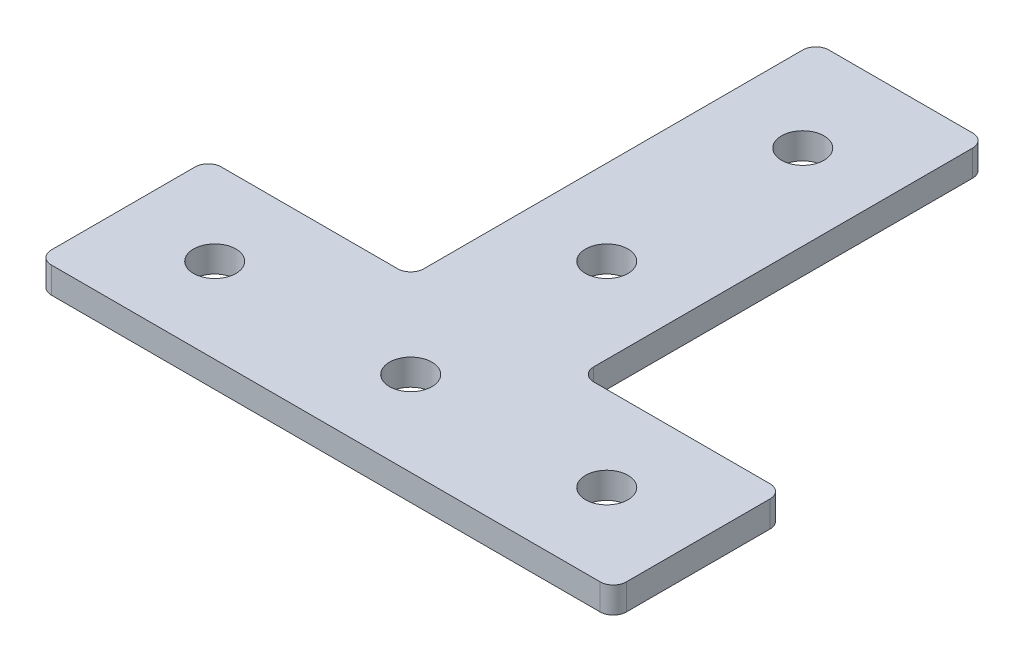
ISO-10303-21;
HEADER;
FILE_DESCRIPTION(('STEP AP214'),'2;1');
FILE_NAME('part.step','',(''),(''),'','','');
FILE_SCHEMA(('AUTOMOTIVE_DESIGN { 1 0 10303 214 1 1 1 1 }'));
ENDSEC;
DATA;
#1=APPLICATION_CONTEXT('core data for automotive mechanical design processes');
#2=APPLICATION_PROTOCOL_DEFINITION('international standard','automotive_design',2000,#1);
#3=PRODUCT_CONTEXT('',#1,'mechanical');
#4=PRODUCT('Part','Part','',(#3));
#5=PRODUCT_RELATED_PRODUCT_CATEGORY('part','',(#4));
#6=PRODUCT_DEFINITION_FORMATION('','',#4);
#7=PRODUCT_DEFINITION_CONTEXT('part definition',#1,'design');
#8=PRODUCT_DEFINITION('design','',#6,#7);
#9=PRODUCT_DEFINITION_SHAPE('','',#8);
#10=(LENGTH_UNIT() NAMED_UNIT(*) SI_UNIT(.MILLI.,.METRE.));
#11=(NAMED_UNIT(*) PLANE_ANGLE_UNIT() SI_UNIT($,.RADIAN.));
#12=(NAMED_UNIT(*) SI_UNIT($,.STERADIAN.) SOLID_ANGLE_UNIT());
#13=UNCERTAINTY_MEASURE_WITH_UNIT(LENGTH_MEASURE(1.E-05),#10,'distance_accuracy_value','');
#14=(GEOMETRIC_REPRESENTATION_CONTEXT(3) GLOBAL_UNCERTAINTY_ASSIGNED_CONTEXT((#13)) GLOBAL_UNIT_ASSIGNED_CONTEXT((#10,
#11,#12)) REPRESENTATION_CONTEXT('',''));
#15=CARTESIAN_POINT('',(0.,0.,0.));
#16=DIRECTION('',(0.,0.,1.));
#17=DIRECTION('',(1.,0.,0.));
#18=AXIS2_PLACEMENT_3D('',#15,#16,#17);
#19=CARTESIAN_POINT('',(44.,4.,-13.));
#20=DIRECTION('',(-1.,0.,0.));
#21=DIRECTION('',(0.,0.,1.));
#22=AXIS2_PLACEMENT_3D('',#19,#20,#21);
#23=PLANE('',#22);
#24=DIRECTION('',(0.,0.,-1.));
#25=VECTOR('',#24,1.);
#26=CARTESIAN_POINT('',(44.,4.,-13.));
#27=LINE('',#26,#25);
#28=CARTESIAN_POINT('',(44.,4.,11.));
#29=VERTEX_POINT('',#28);
#30=CARTESIAN_POINT('',(44.,4.,-11.));
#31=VERTEX_POINT('',#30);
#32=EDGE_CURVE('E180',#29,#31,#27,.T.);
#33=ORIENTED_EDGE('',*,*,#32,.F.);
#34=DIRECTION('',(0.,-1.,0.));
#35=VECTOR('',#34,1.);
#36=CARTESIAN_POINT('',(44.,4.,11.));
#37=LINE('',#36,#35);
#38=CARTESIAN_POINT('',(44.,0.,11.));
#39=VERTEX_POINT('',#38);
#40=EDGE_CURVE('E224',#29,#39,#37,.T.);
#41=ORIENTED_EDGE('',*,*,#40,.T.);
#42=DIRECTION('',(0.,0.,-1.));
#43=VECTOR('',#42,1.);
#44=CARTESIAN_POINT('',(44.,0.,-13.));
#45=LINE('',#44,#43);
#46=CARTESIAN_POINT('',(44.,0.,-11.));
#47=VERTEX_POINT('',#46);
#48=EDGE_CURVE('E258',#39,#47,#45,.T.);
#49=ORIENTED_EDGE('',*,*,#48,.T.);
#50=DIRECTION('',(0.,-1.,0.));
#51=VECTOR('',#50,1.);
#52=CARTESIAN_POINT('',(44.,4.,-11.));
#53=LINE('',#52,#51);
#54=EDGE_CURVE('E222',#47,#31,#53,.F.);
#55=ORIENTED_EDGE('',*,*,#54,.T.);
#56=EDGE_LOOP('',(#33,#41,#49,#55));
#57=FACE_BOUND('',#56,.T.);
#58=ADVANCED_FACE('F39',(#57),#23,.F.);
#59=CARTESIAN_POINT('',(44.,4.,-13.));
#60=DIRECTION('',(0.,0.,1.));
#61=DIRECTION('',(1.,0.,0.));
#62=AXIS2_PLACEMENT_3D('',#59,#60,#61);
#63=PLANE('',#62);
#64=DIRECTION('',(-1.,0.,0.));
#65=VECTOR('',#64,1.);
#66=CARTESIAN_POINT('',(44.,4.,-13.));
#67=LINE('',#66,#65);
#68=CARTESIAN_POINT('',(42.,4.,-13.));
#69=VERTEX_POINT('',#68);
#70=CARTESIAN_POINT('',(15.,4.,-13.));
#71=VERTEX_POINT('',#70);
#72=EDGE_CURVE('E184',#69,#71,#67,.T.);
#73=ORIENTED_EDGE('',*,*,#72,.F.);
#74=DIRECTION('',(0.,-1.,0.));
#75=VECTOR('',#74,1.);
#76=CARTESIAN_POINT('',(42.,4.,-13.));
#77=LINE('',#76,#75);
#78=CARTESIAN_POINT('',(42.,0.,-13.));
#79=VERTEX_POINT('',#78);
#80=EDGE_CURVE('E229',#69,#79,#77,.T.);
#81=ORIENTED_EDGE('',*,*,#80,.T.);
#82=DIRECTION('',(-1.,0.,0.));
#83=VECTOR('',#82,1.);
#84=CARTESIAN_POINT('',(44.,0.,-13.));
#85=LINE('',#84,#83);
#86=CARTESIAN_POINT('',(15.,0.,-13.));
#87=VERTEX_POINT('',#86);
#88=EDGE_CURVE('E247',#79,#87,#85,.T.);
#89=ORIENTED_EDGE('',*,*,#88,.T.);
#90=DIRECTION('',(0.,-1.,0.));
#91=VECTOR('',#90,1.);
#92=CARTESIAN_POINT('',(15.,4.,-13.));
#93=LINE('',#92,#91);
#94=EDGE_CURVE('E227',#87,#71,#93,.F.);
#95=ORIENTED_EDGE('',*,*,#94,.T.);
#96=EDGE_LOOP('',(#73,#81,#89,#95));
#97=FACE_BOUND('',#96,.T.);
#98=ADVANCED_FACE('F255',(#97),#63,.F.);
#99=CARTESIAN_POINT('',(13.,4.,-13.));
#100=DIRECTION('',(-1.,0.,0.));
#101=DIRECTION('',(0.,0.,1.));
#102=AXIS2_PLACEMENT_3D('',#99,#100,#101);
#103=PLANE('',#102);
#104=DIRECTION('',(0.,0.,-1.));
#105=VECTOR('',#104,1.);
#106=CARTESIAN_POINT('',(13.,4.,-13.));
#107=LINE('',#106,#105);
#108=CARTESIAN_POINT('',(13.,4.,-15.));
#109=VERTEX_POINT('',#108);
#110=CARTESIAN_POINT('',(13.,4.,-73.));
#111=VERTEX_POINT('',#110);
#112=EDGE_CURVE('E266',#109,#111,#107,.T.);
#113=ORIENTED_EDGE('',*,*,#112,.F.);
#114=DIRECTION('',(0.,-1.,0.));
#115=VECTOR('',#114,1.);
#116=CARTESIAN_POINT('',(13.,0.,-15.));
#117=LINE('',#116,#115);
#118=CARTESIAN_POINT('',(13.,0.,-15.));
#119=VERTEX_POINT('',#118);
#120=EDGE_CURVE('E234',#109,#119,#117,.T.);
#121=ORIENTED_EDGE('',*,*,#120,.T.);
#122=DIRECTION('',(0.,0.,-1.));
#123=VECTOR('',#122,1.);
#124=CARTESIAN_POINT('',(13.,0.,-13.));
#125=LINE('',#124,#123);
#126=CARTESIAN_POINT('',(13.,0.,-73.));
#127=VERTEX_POINT('',#126);
#128=EDGE_CURVE('E249',#119,#127,#125,.T.);
#129=ORIENTED_EDGE('',*,*,#128,.T.);
#130=DIRECTION('',(0.,-1.,0.));
#131=VECTOR('',#130,1.);
#132=CARTESIAN_POINT('',(13.,4.,-73.));
#133=LINE('',#132,#131);
#134=EDGE_CURVE('E232',#127,#111,#133,.F.);
#135=ORIENTED_EDGE('',*,*,#134,.T.);
#136=EDGE_LOOP('',(#113,#121,#129,#135));
#137=FACE_BOUND('',#136,.T.);
#138=ADVANCED_FACE('F269',(#137),#103,.F.);
#139=CARTESIAN_POINT('',(-13.,4.,-75.));
#140=DIRECTION('',(0.,0.,1.));
#141=DIRECTION('',(1.,0.,0.));
#142=AXIS2_PLACEMENT_3D('',#139,#140,#141);
#143=PLANE('',#142);
#144=DIRECTION('',(-1.,0.,0.));
#145=VECTOR('',#144,1.);
#146=CARTESIAN_POINT('',(-13.,4.,-75.));
#147=LINE('',#146,#145);
#148=CARTESIAN_POINT('',(11.,4.,-75.));
#149=VERTEX_POINT('',#148);
#150=CARTESIAN_POINT('',(-11.,4.,-75.));
#151=VERTEX_POINT('',#150);
#152=EDGE_CURVE('E271',#149,#151,#147,.T.);
#153=ORIENTED_EDGE('',*,*,#152,.F.);
#154=DIRECTION('',(0.,-1.,0.));
#155=VECTOR('',#154,1.);
#156=CARTESIAN_POINT('',(11.,4.,-75.));
#157=LINE('',#156,#155);
#158=CARTESIAN_POINT('',(11.,0.,-75.));
#159=VERTEX_POINT('',#158);
#160=EDGE_CURVE('E239',#149,#159,#157,.T.);
#161=ORIENTED_EDGE('',*,*,#160,.T.);
#162=DIRECTION('',(-1.,0.,0.));
#163=VECTOR('',#162,1.);
#164=CARTESIAN_POINT('',(-13.,0.,-75.));
#165=LINE('',#164,#163);
#166=CARTESIAN_POINT('',(-11.,0.,-75.));
#167=VERTEX_POINT('',#166);
#168=EDGE_CURVE('E288',#159,#167,#165,.T.);
#169=ORIENTED_EDGE('',*,*,#168,.T.);
#170=DIRECTION('',(0.,-1.,0.));
#171=VECTOR('',#170,1.);
#172=CARTESIAN_POINT('',(-11.,4.,-75.));
#173=LINE('',#172,#171);
#174=EDGE_CURVE('E237',#167,#151,#173,.F.);
#175=ORIENTED_EDGE('',*,*,#174,.T.);
#176=EDGE_LOOP('',(#153,#161,#169,#175));
#177=FACE_BOUND('',#176,.T.);
#178=ADVANCED_FACE('F352',(#177),#143,.F.);
#179=CARTESIAN_POINT('',(-13.,4.,-13.));
#180=DIRECTION('',(1.,0.,0.));
#181=DIRECTION('',(0.,0.,-1.));
#182=AXIS2_PLACEMENT_3D('',#179,#180,#181);
#183=PLANE('',#182);
#184=DIRECTION('',(0.,0.,1.));
#185=VECTOR('',#184,1.);
#186=CARTESIAN_POINT('',(-13.,0.,-13.));
#187=LINE('',#186,#185);
#188=CARTESIAN_POINT('',(-13.,0.,-73.));
#189=VERTEX_POINT('',#188);
#190=CARTESIAN_POINT('',(-13.,0.,-15.));
#191=VERTEX_POINT('',#190);
#192=EDGE_CURVE('E291',#189,#191,#187,.T.);
#193=ORIENTED_EDGE('',*,*,#192,.T.);
#194=DIRECTION('',(0.,-1.,0.));
#195=VECTOR('',#194,1.);
#196=CARTESIAN_POINT('',(-13.,4.,-15.));
#197=LINE('',#196,#195);
#198=CARTESIAN_POINT('',(-13.,4.,-15.));
#199=VERTEX_POINT('',#198);
#200=EDGE_CURVE('E220',#191,#199,#197,.F.);
#201=ORIENTED_EDGE('',*,*,#200,.T.);
#202=DIRECTION('',(0.,0.,1.));
#203=VECTOR('',#202,1.);
#204=CARTESIAN_POINT('',(-13.,4.,-13.));
#205=LINE('',#204,#203);
#206=CARTESIAN_POINT('',(-13.,4.,-73.));
#207=VERTEX_POINT('',#206);
#208=EDGE_CURVE('E274',#207,#199,#205,.T.);
#209=ORIENTED_EDGE('',*,*,#208,.F.);
#210=DIRECTION('',(0.,-1.,0.));
#211=VECTOR('',#210,1.);
#212=CARTESIAN_POINT('',(-13.,4.,-73.));
#213=LINE('',#212,#211);
#214=EDGE_CURVE('E217',#207,#189,#213,.T.);
#215=ORIENTED_EDGE('',*,*,#214,.T.);
#216=EDGE_LOOP('',(#193,#201,#209,#215));
#217=FACE_BOUND('',#216,.T.);
#218=ADVANCED_FACE('F310',(#217),#183,.F.);
#219=CARTESIAN_POINT('',(-44.,4.,-13.));
#220=DIRECTION('',(0.,0.,1.));
#221=DIRECTION('',(1.,0.,0.));
#222=AXIS2_PLACEMENT_3D('',#219,#220,#221);
#223=PLANE('',#222);
#224=DIRECTION('',(-1.,0.,0.));
#225=VECTOR('',#224,1.);
#226=CARTESIAN_POINT('',(-44.,0.,-13.));
#227=LINE('',#226,#225);
#228=CARTESIAN_POINT('',(-15.,0.,-13.));
#229=VERTEX_POINT('',#228);
#230=CARTESIAN_POINT('',(-42.,0.,-13.));
#231=VERTEX_POINT('',#230);
#232=EDGE_CURVE('E186',#229,#231,#227,.T.);
#233=ORIENTED_EDGE('',*,*,#232,.T.);
#234=DIRECTION('',(0.,-1.,0.));
#235=VECTOR('',#234,1.);
#236=CARTESIAN_POINT('',(-42.,4.,-13.));
#237=LINE('',#236,#235);
#238=CARTESIAN_POINT('',(-42.,4.,-13.));
#239=VERTEX_POINT('',#238);
#240=EDGE_CURVE('E54',#231,#239,#237,.F.);
#241=ORIENTED_EDGE('',*,*,#240,.T.);
#242=DIRECTION('',(-1.,0.,0.));
#243=VECTOR('',#242,1.);
#244=CARTESIAN_POINT('',(-44.,4.,-13.));
#245=LINE('',#244,#243);
#246=CARTESIAN_POINT('',(-15.,4.,-13.));
#247=VERTEX_POINT('',#246);
#248=EDGE_CURVE('E279',#247,#239,#245,.T.);
#249=ORIENTED_EDGE('',*,*,#248,.F.);
#250=DIRECTION('',(0.,-1.,0.));
#251=VECTOR('',#250,1.);
#252=CARTESIAN_POINT('',(-15.,0.,-13.));
#253=LINE('',#252,#251);
#254=EDGE_CURVE('E213',#247,#229,#253,.T.);
#255=ORIENTED_EDGE('',*,*,#254,.T.);
#256=EDGE_LOOP('',(#233,#241,#249,#255));
#257=FACE_BOUND('',#256,.T.);
#258=ADVANCED_FACE('F294',(#257),#223,.F.);
#259=CARTESIAN_POINT('',(-44.,4.,-13.));
#260=DIRECTION('',(1.,0.,0.));
#261=DIRECTION('',(0.,0.,-1.));
#262=AXIS2_PLACEMENT_3D('',#259,#260,#261);
#263=PLANE('',#262);
#264=DIRECTION('',(0.,0.,1.));
#265=VECTOR('',#264,1.);
#266=CARTESIAN_POINT('',(-44.,0.,-13.));
#267=LINE('',#266,#265);
#268=CARTESIAN_POINT('',(-44.,0.,-11.));
#269=VERTEX_POINT('',#268);
#270=CARTESIAN_POINT('',(-44.,0.,11.));
#271=VERTEX_POINT('',#270);
#272=EDGE_CURVE('E181',#269,#271,#267,.T.);
#273=ORIENTED_EDGE('',*,*,#272,.T.);
#274=DIRECTION('',(0.,-1.,0.));
#275=VECTOR('',#274,1.);
#276=CARTESIAN_POINT('',(-44.,4.,11.));
#277=LINE('',#276,#275);
#278=CARTESIAN_POINT('',(-44.,4.,11.));
#279=VERTEX_POINT('',#278);
#280=EDGE_CURVE('E158',#271,#279,#277,.F.);
#281=ORIENTED_EDGE('',*,*,#280,.T.);
#282=DIRECTION('',(0.,0.,1.));
#283=VECTOR('',#282,1.);
#284=CARTESIAN_POINT('',(-44.,4.,-13.));
#285=LINE('',#284,#283);
#286=CARTESIAN_POINT('',(-44.,4.,-11.));
#287=VERTEX_POINT('',#286);
#288=EDGE_CURVE('E281',#287,#279,#285,.T.);
#289=ORIENTED_EDGE('',*,*,#288,.F.);
#290=DIRECTION('',(0.,-1.,0.));
#291=VECTOR('',#290,1.);
#292=CARTESIAN_POINT('',(-44.,4.,-11.));
#293=LINE('',#292,#291);
#294=EDGE_CURVE('E163',#287,#269,#293,.T.);
#295=ORIENTED_EDGE('',*,*,#294,.T.);
#296=EDGE_LOOP('',(#273,#281,#289,#295));
#297=FACE_BOUND('',#296,.T.);
#298=ADVANCED_FACE('F302',(#297),#263,.F.);
#299=CARTESIAN_POINT('',(-44.,4.,13.));
#300=DIRECTION('',(0.,0.,-1.));
#301=DIRECTION('',(-1.,0.,0.));
#302=AXIS2_PLACEMENT_3D('',#299,#300,#301);
#303=PLANE('',#302);
#304=DIRECTION('',(1.,0.,0.));
#305=VECTOR('',#304,1.);
#306=CARTESIAN_POINT('',(-44.,4.,13.));
#307=LINE('',#306,#305);
#308=CARTESIAN_POINT('',(-42.,4.,13.));
#309=VERTEX_POINT('',#308);
#310=CARTESIAN_POINT('',(42.,4.,13.));
#311=VERTEX_POINT('',#310);
#312=EDGE_CURVE('E173',#309,#311,#307,.T.);
#313=ORIENTED_EDGE('',*,*,#312,.F.);
#314=DIRECTION('',(0.,-1.,0.));
#315=VECTOR('',#314,1.);
#316=CARTESIAN_POINT('',(-42.,4.,13.));
#317=LINE('',#316,#315);
#318=CARTESIAN_POINT('',(-42.,0.,13.));
#319=VERTEX_POINT('',#318);
#320=EDGE_CURVE('E157',#309,#319,#317,.T.);
#321=ORIENTED_EDGE('',*,*,#320,.T.);
#322=DIRECTION('',(1.,0.,0.));
#323=VECTOR('',#322,1.);
#324=CARTESIAN_POINT('',(-44.,0.,13.));
#325=LINE('',#324,#323);
#326=CARTESIAN_POINT('',(42.,0.,13.));
#327=VERTEX_POINT('',#326);
#328=EDGE_CURVE('E170',#319,#327,#325,.T.);
#329=ORIENTED_EDGE('',*,*,#328,.T.);
#330=DIRECTION('',(0.,-1.,0.));
#331=VECTOR('',#330,1.);
#332=CARTESIAN_POINT('',(42.,4.,13.));
#333=LINE('',#332,#331);
#334=EDGE_CURVE('E175',#327,#311,#333,.F.);
#335=ORIENTED_EDGE('',*,*,#334,.T.);
#336=EDGE_LOOP('',(#313,#321,#329,#335));
#337=FACE_BOUND('',#336,.T.);
#338=ADVANCED_FACE('F169',(#337),#303,.F.);
#339=CARTESIAN_POINT('',(0.,4.,0.));
#340=DIRECTION('',(0.,1.,0.));
#341=DIRECTION('',(0.,0.,1.));
#342=AXIS2_PLACEMENT_3D('',#339,#340,#341);
#343=PLANE('',#342);
#344=CARTESIAN_POINT('',(3.12396350297161E-13,4.,-30.));
#345=DIRECTION('',(0.,1.,0.));
#346=DIRECTION('',(0.,0.,1.));
#347=AXIS2_PLACEMENT_3D('',#344,#345,#346);
#348=CIRCLE('',#347,3.25);
#349=CARTESIAN_POINT('',(3.12396350297161E-13,4.,-26.75));
#350=VERTEX_POINT('',#349);
#351=EDGE_CURVE('E518',#350,#350,#348,.T.);
#352=ORIENTED_EDGE('',*,*,#351,.F.);
#353=EDGE_LOOP('',(#352));
#354=FACE_BOUND('',#353,.T.);
#355=CARTESIAN_POINT('',(0.,4.,-60.));
#356=DIRECTION('',(0.,1.,0.));
#357=DIRECTION('',(0.,0.,1.));
#358=AXIS2_PLACEMENT_3D('',#355,#356,#357);
#359=CIRCLE('',#358,3.25);
#360=CARTESIAN_POINT('',(0.,4.,-56.75));
#361=VERTEX_POINT('',#360);
#362=EDGE_CURVE('E522',#361,#361,#359,.T.);
#363=ORIENTED_EDGE('',*,*,#362,.F.);
#364=EDGE_LOOP('',(#363));
#365=FACE_BOUND('',#364,.T.);
#366=CARTESIAN_POINT('',(-30.,4.,2.09488880330588E-13));
#367=DIRECTION('',(0.,1.,0.));
#368=DIRECTION('',(0.,0.,1.));
#369=AXIS2_PLACEMENT_3D('',#366,#367,#368);
#370=CIRCLE('',#369,3.25);
#371=CARTESIAN_POINT('',(-30.,4.,3.25000000000021));
#372=VERTEX_POINT('',#371);
#373=EDGE_CURVE('E540',#372,#372,#370,.T.);
#374=ORIENTED_EDGE('',*,*,#373,.F.);
#375=EDGE_LOOP('',(#374));
#376=FACE_BOUND('',#375,.T.);
#377=CARTESIAN_POINT('',(30.,4.,0.));
#378=DIRECTION('',(0.,1.,0.));
#379=DIRECTION('',(0.,0.,1.));
#380=AXIS2_PLACEMENT_3D('',#377,#378,#379);
#381=CIRCLE('',#380,3.25);
#382=CARTESIAN_POINT('',(30.,4.,3.25));
#383=VERTEX_POINT('',#382);
#384=EDGE_CURVE('E531',#383,#383,#381,.T.);
#385=ORIENTED_EDGE('',*,*,#384,.F.);
#386=EDGE_LOOP('',(#385));
#387=FACE_BOUND('',#386,.T.);
#388=CARTESIAN_POINT('',(0.,4.,0.));
#389=DIRECTION('',(0.,1.,0.));
#390=DIRECTION('',(0.,0.,1.));
#391=AXIS2_PLACEMENT_3D('',#388,#389,#390);
#392=CIRCLE('',#391,3.25);
#393=CARTESIAN_POINT('',(0.,4.,3.25));
#394=VERTEX_POINT('',#393);
#395=EDGE_CURVE('E529',#394,#394,#392,.T.);
#396=ORIENTED_EDGE('',*,*,#395,.F.);
#397=EDGE_LOOP('',(#396));
#398=FACE_BOUND('',#397,.T.);
#399=ORIENTED_EDGE('',*,*,#288,.T.);
#400=CARTESIAN_POINT('',(-42.,4.,11.));
#401=DIRECTION('',(0.,1.,0.));
#402=DIRECTION('',(0.,0.,1.));
#403=AXIS2_PLACEMENT_3D('',#400,#401,#402);
#404=CIRCLE('',#403,2.);
#405=EDGE_CURVE('E211',#279,#309,#404,.T.);
#406=ORIENTED_EDGE('',*,*,#405,.T.);
#407=ORIENTED_EDGE('',*,*,#312,.T.);
#408=CARTESIAN_POINT('',(42.,4.,11.));
#409=DIRECTION('',(0.,1.,0.));
#410=DIRECTION('',(0.,0.,1.));
#411=AXIS2_PLACEMENT_3D('',#408,#409,#410);
#412=CIRCLE('',#411,2.);
#413=EDGE_CURVE('E207',#311,#29,#412,.T.);
#414=ORIENTED_EDGE('',*,*,#413,.T.);
#415=ORIENTED_EDGE('',*,*,#32,.T.);
#416=CARTESIAN_POINT('',(42.,4.,-11.));
#417=DIRECTION('',(0.,1.,0.));
#418=DIRECTION('',(0.,0.,1.));
#419=AXIS2_PLACEMENT_3D('',#416,#417,#418);
#420=CIRCLE('',#419,2.);
#421=EDGE_CURVE('E205',#31,#69,#420,.T.);
#422=ORIENTED_EDGE('',*,*,#421,.T.);
#423=ORIENTED_EDGE('',*,*,#72,.T.);
#424=CARTESIAN_POINT('',(15.,4.,-15.));
#425=DIRECTION('',(0.,1.,0.));
#426=DIRECTION('',(0.,0.,1.));
#427=AXIS2_PLACEMENT_3D('',#424,#425,#426);
#428=CIRCLE('',#427,2.);
#429=EDGE_CURVE('E11',#71,#109,#428,.F.);
#430=ORIENTED_EDGE('',*,*,#429,.T.);
#431=ORIENTED_EDGE('',*,*,#112,.T.);
#432=CARTESIAN_POINT('',(11.,4.,-73.));
#433=DIRECTION('',(0.,1.,0.));
#434=DIRECTION('',(0.,0.,1.));
#435=AXIS2_PLACEMENT_3D('',#432,#433,#434);
#436=CIRCLE('',#435,2.);
#437=EDGE_CURVE('E203',#111,#149,#436,.T.);
#438=ORIENTED_EDGE('',*,*,#437,.T.);
#439=ORIENTED_EDGE('',*,*,#152,.T.);
#440=CARTESIAN_POINT('',(-11.,4.,-73.));
#441=DIRECTION('',(0.,1.,0.));
#442=DIRECTION('',(0.,0.,1.));
#443=AXIS2_PLACEMENT_3D('',#440,#441,#442);
#444=CIRCLE('',#443,2.);
#445=EDGE_CURVE('E201',#151,#207,#444,.T.);
#446=ORIENTED_EDGE('',*,*,#445,.T.);
#447=ORIENTED_EDGE('',*,*,#208,.T.);
#448=CARTESIAN_POINT('',(-15.,4.,-15.));
#449=DIRECTION('',(0.,1.,0.));
#450=DIRECTION('',(0.,0.,1.));
#451=AXIS2_PLACEMENT_3D('',#448,#449,#450);
#452=CIRCLE('',#451,2.);
#453=EDGE_CURVE('E61',#199,#247,#452,.F.);
#454=ORIENTED_EDGE('',*,*,#453,.T.);
#455=ORIENTED_EDGE('',*,*,#248,.T.);
#456=CARTESIAN_POINT('',(-42.,4.,-11.));
#457=DIRECTION('',(0.,1.,0.));
#458=DIRECTION('',(0.,0.,1.));
#459=AXIS2_PLACEMENT_3D('',#456,#457,#458);
#460=CIRCLE('',#459,2.);
#461=EDGE_CURVE('E209',#239,#287,#460,.T.);
#462=ORIENTED_EDGE('',*,*,#461,.T.);
#463=EDGE_LOOP('',(#399,#406,#407,#414,#415,#422,#423,#430,#431,#438,#439,#446,#447,#454,#455,#462));
#464=FACE_BOUND('',#463,.T.);
#465=ADVANCED_FACE('F265',(#354,#365,#376,#387,#398,#464),#343,.T.);
#466=CARTESIAN_POINT('',(0.,0.,0.));
#467=DIRECTION('',(0.,1.,0.));
#468=DIRECTION('',(0.,0.,1.));
#469=AXIS2_PLACEMENT_3D('',#466,#467,#468);
#470=PLANE('',#469);
#471=CARTESIAN_POINT('',(3.12396350297161E-13,0.,-30.));
#472=DIRECTION('',(0.,1.,0.));
#473=DIRECTION('',(0.,0.,1.));
#474=AXIS2_PLACEMENT_3D('',#471,#472,#473);
#475=CIRCLE('',#474,3.25);
#476=CARTESIAN_POINT('',(3.12396350297161E-13,0.,-26.75));
#477=VERTEX_POINT('',#476);
#478=EDGE_CURVE('E515',#477,#477,#475,.T.);
#479=ORIENTED_EDGE('',*,*,#478,.T.);
#480=EDGE_LOOP('',(#479));
#481=FACE_BOUND('',#480,.T.);
#482=CARTESIAN_POINT('',(0.,0.,-60.));
#483=DIRECTION('',(0.,1.,0.));
#484=DIRECTION('',(0.,0.,1.));
#485=AXIS2_PLACEMENT_3D('',#482,#483,#484);
#486=CIRCLE('',#485,3.25);
#487=CARTESIAN_POINT('',(0.,0.,-56.75));
#488=VERTEX_POINT('',#487);
#489=EDGE_CURVE('E519',#488,#488,#486,.T.);
#490=ORIENTED_EDGE('',*,*,#489,.T.);
#491=EDGE_LOOP('',(#490));
#492=FACE_BOUND('',#491,.T.);
#493=CARTESIAN_POINT('',(-30.,0.,2.09488880330588E-13));
#494=DIRECTION('',(0.,1.,0.));
#495=DIRECTION('',(0.,0.,1.));
#496=AXIS2_PLACEMENT_3D('',#493,#494,#495);
#497=CIRCLE('',#496,3.25);
#498=CARTESIAN_POINT('',(-30.,0.,3.25000000000021));
#499=VERTEX_POINT('',#498);
#500=EDGE_CURVE('E545',#499,#499,#497,.T.);
#501=ORIENTED_EDGE('',*,*,#500,.T.);
#502=EDGE_LOOP('',(#501));
#503=FACE_BOUND('',#502,.T.);
#504=CARTESIAN_POINT('',(30.,0.,0.));
#505=DIRECTION('',(0.,1.,0.));
#506=DIRECTION('',(0.,0.,1.));
#507=AXIS2_PLACEMENT_3D('',#504,#505,#506);
#508=CIRCLE('',#507,3.25);
#509=CARTESIAN_POINT('',(30.,0.,3.25));
#510=VERTEX_POINT('',#509);
#511=EDGE_CURVE('E535',#510,#510,#508,.T.);
#512=ORIENTED_EDGE('',*,*,#511,.T.);
#513=EDGE_LOOP('',(#512));
#514=FACE_BOUND('',#513,.T.);
#515=CARTESIAN_POINT('',(0.,0.,0.));
#516=DIRECTION('',(0.,1.,0.));
#517=DIRECTION('',(0.,0.,1.));
#518=AXIS2_PLACEMENT_3D('',#515,#516,#517);
#519=CIRCLE('',#518,3.25);
#520=CARTESIAN_POINT('',(0.,0.,3.25));
#521=VERTEX_POINT('',#520);
#522=EDGE_CURVE('E285',#521,#521,#519,.T.);
#523=ORIENTED_EDGE('',*,*,#522,.T.);
#524=EDGE_LOOP('',(#523));
#525=FACE_BOUND('',#524,.T.);
#526=ORIENTED_EDGE('',*,*,#328,.F.);
#527=CARTESIAN_POINT('',(-42.,0.,11.));
#528=DIRECTION('',(0.,1.,0.));
#529=DIRECTION('',(0.,0.,1.));
#530=AXIS2_PLACEMENT_3D('',#527,#528,#529);
#531=CIRCLE('',#530,2.);
#532=EDGE_CURVE('E153',#319,#271,#531,.F.);
#533=ORIENTED_EDGE('',*,*,#532,.T.);
#534=ORIENTED_EDGE('',*,*,#272,.F.);
#535=CARTESIAN_POINT('',(-42.,0.,-11.));
#536=DIRECTION('',(0.,1.,0.));
#537=DIRECTION('',(0.,0.,1.));
#538=AXIS2_PLACEMENT_3D('',#535,#536,#537);
#539=CIRCLE('',#538,2.);
#540=EDGE_CURVE('E164',#269,#231,#539,.F.);
#541=ORIENTED_EDGE('',*,*,#540,.T.);
#542=ORIENTED_EDGE('',*,*,#232,.F.);
#543=CARTESIAN_POINT('',(-15.,0.,-15.));
#544=DIRECTION('',(0.,1.,0.));
#545=DIRECTION('',(0.,0.,1.));
#546=AXIS2_PLACEMENT_3D('',#543,#544,#545);
#547=CIRCLE('',#546,2.);
#548=EDGE_CURVE('E242',#229,#191,#547,.T.);
#549=ORIENTED_EDGE('',*,*,#548,.T.);
#550=ORIENTED_EDGE('',*,*,#192,.F.);
#551=CARTESIAN_POINT('',(-11.,0.,-73.));
#552=DIRECTION('',(0.,1.,0.));
#553=DIRECTION('',(0.,0.,1.));
#554=AXIS2_PLACEMENT_3D('',#551,#552,#553);
#555=CIRCLE('',#554,2.);
#556=EDGE_CURVE('E174',#189,#167,#555,.F.);
#557=ORIENTED_EDGE('',*,*,#556,.T.);
#558=ORIENTED_EDGE('',*,*,#168,.F.);
#559=CARTESIAN_POINT('',(11.,0.,-73.));
#560=DIRECTION('',(0.,1.,0.));
#561=DIRECTION('',(0.,0.,1.));
#562=AXIS2_PLACEMENT_3D('',#559,#560,#561);
#563=CIRCLE('',#562,2.);
#564=EDGE_CURVE('E192',#159,#127,#563,.F.);
#565=ORIENTED_EDGE('',*,*,#564,.T.);
#566=ORIENTED_EDGE('',*,*,#128,.F.);
#567=CARTESIAN_POINT('',(15.,0.,-15.));
#568=DIRECTION('',(0.,1.,0.));
#569=DIRECTION('',(0.,0.,1.));
#570=AXIS2_PLACEMENT_3D('',#567,#568,#569);
#571=CIRCLE('',#570,2.);
#572=EDGE_CURVE('E47',#119,#87,#571,.T.);
#573=ORIENTED_EDGE('',*,*,#572,.T.);
#574=ORIENTED_EDGE('',*,*,#88,.F.);
#575=CARTESIAN_POINT('',(42.,0.,-11.));
#576=DIRECTION('',(0.,1.,0.));
#577=DIRECTION('',(0.,0.,1.));
#578=AXIS2_PLACEMENT_3D('',#575,#576,#577);
#579=CIRCLE('',#578,2.);
#580=EDGE_CURVE('E194',#79,#47,#579,.F.);
#581=ORIENTED_EDGE('',*,*,#580,.T.);
#582=ORIENTED_EDGE('',*,*,#48,.F.);
#583=CARTESIAN_POINT('',(42.,0.,11.));
#584=DIRECTION('',(0.,1.,0.));
#585=DIRECTION('',(0.,0.,1.));
#586=AXIS2_PLACEMENT_3D('',#583,#584,#585);
#587=CIRCLE('',#586,2.);
#588=EDGE_CURVE('E179',#39,#327,#587,.F.);
#589=ORIENTED_EDGE('',*,*,#588,.T.);
#590=EDGE_LOOP('',(#526,#533,#534,#541,#542,#549,#550,#557,#558,#565,#566,#573,#574,#581,#582,#589));
#591=FACE_BOUND('',#590,.T.);
#592=ADVANCED_FACE('F177',(#481,#492,#503,#514,#525,#591),#470,.F.);
#593=CARTESIAN_POINT('',(0.,0.,0.));
#594=DIRECTION('',(0.,1.,0.));
#595=DIRECTION('',(0.,0.,1.));
#596=AXIS2_PLACEMENT_3D('',#593,#594,#595);
#597=CYLINDRICAL_SURFACE('',#596,3.25);
#598=ORIENTED_EDGE('',*,*,#522,.F.);
#599=EDGE_LOOP('',(#598));
#600=FACE_BOUND('',#599,.T.);
#601=ORIENTED_EDGE('',*,*,#395,.T.);
#602=EDGE_LOOP('',(#601));
#603=FACE_BOUND('',#602,.T.);
#604=ADVANCED_FACE('F415',(#600,#603),#597,.F.);
#605=CARTESIAN_POINT('',(30.,0.,0.));
#606=DIRECTION('',(0.,1.,0.));
#607=DIRECTION('',(0.,0.,1.));
#608=AXIS2_PLACEMENT_3D('',#605,#606,#607);
#609=CYLINDRICAL_SURFACE('',#608,3.25);
#610=ORIENTED_EDGE('',*,*,#511,.F.);
#611=EDGE_LOOP('',(#610));
#612=FACE_BOUND('',#611,.T.);
#613=ORIENTED_EDGE('',*,*,#384,.T.);
#614=EDGE_LOOP('',(#613));
#615=FACE_BOUND('',#614,.T.);
#616=ADVANCED_FACE('F425',(#612,#615),#609,.F.);
#617=CARTESIAN_POINT('',(-30.,0.,2.09488880330588E-13));
#618=DIRECTION('',(0.,1.,0.));
#619=DIRECTION('',(0.,0.,1.));
#620=AXIS2_PLACEMENT_3D('',#617,#618,#619);
#621=CYLINDRICAL_SURFACE('',#620,3.25);
#622=ORIENTED_EDGE('',*,*,#500,.F.);
#623=EDGE_LOOP('',(#622));
#624=FACE_BOUND('',#623,.T.);
#625=ORIENTED_EDGE('',*,*,#373,.T.);
#626=EDGE_LOOP('',(#625));
#627=FACE_BOUND('',#626,.T.);
#628=ADVANCED_FACE('F435',(#624,#627),#621,.F.);
#629=CARTESIAN_POINT('',(0.,0.,-60.));
#630=DIRECTION('',(0.,1.,0.));
#631=DIRECTION('',(0.,0.,1.));
#632=AXIS2_PLACEMENT_3D('',#629,#630,#631);
#633=CYLINDRICAL_SURFACE('',#632,3.25);
#634=ORIENTED_EDGE('',*,*,#489,.F.);
#635=EDGE_LOOP('',(#634));
#636=FACE_BOUND('',#635,.T.);
#637=ORIENTED_EDGE('',*,*,#362,.T.);
#638=EDGE_LOOP('',(#637));
#639=FACE_BOUND('',#638,.T.);
#640=ADVANCED_FACE('F445',(#636,#639),#633,.F.);
#641=CARTESIAN_POINT('',(3.12396350297161E-13,0.,-30.));
#642=DIRECTION('',(0.,1.,0.));
#643=DIRECTION('',(0.,0.,1.));
#644=AXIS2_PLACEMENT_3D('',#641,#642,#643);
#645=CYLINDRICAL_SURFACE('',#644,3.25);
#646=ORIENTED_EDGE('',*,*,#478,.F.);
#647=EDGE_LOOP('',(#646));
#648=FACE_BOUND('',#647,.T.);
#649=ORIENTED_EDGE('',*,*,#351,.T.);
#650=EDGE_LOOP('',(#649));
#651=FACE_BOUND('',#650,.T.);
#652=ADVANCED_FACE('F325',(#648,#651),#645,.F.);
#653=CARTESIAN_POINT('',(-42.,4.,11.));
#654=DIRECTION('',(0.,-1.,0.));
#655=DIRECTION('',(0.,0.,-1.));
#656=AXIS2_PLACEMENT_3D('',#653,#654,#655);
#657=CYLINDRICAL_SURFACE('',#656,2.);
#658=ORIENTED_EDGE('',*,*,#405,.F.);
#659=ORIENTED_EDGE('',*,*,#280,.F.);
#660=ORIENTED_EDGE('',*,*,#532,.F.);
#661=ORIENTED_EDGE('',*,*,#320,.F.);
#662=EDGE_LOOP('',(#658,#659,#660,#661));
#663=FACE_BOUND('',#662,.T.);
#664=ADVANCED_FACE('F156',(#663),#657,.T.);
#665=CARTESIAN_POINT('',(-42.,4.,-11.));
#666=DIRECTION('',(0.,-1.,0.));
#667=DIRECTION('',(0.,0.,-1.));
#668=AXIS2_PLACEMENT_3D('',#665,#666,#667);
#669=CYLINDRICAL_SURFACE('',#668,2.);
#670=ORIENTED_EDGE('',*,*,#461,.F.);
#671=ORIENTED_EDGE('',*,*,#240,.F.);
#672=ORIENTED_EDGE('',*,*,#540,.F.);
#673=ORIENTED_EDGE('',*,*,#294,.F.);
#674=EDGE_LOOP('',(#670,#671,#672,#673));
#675=FACE_BOUND('',#674,.T.);
#676=ADVANCED_FACE('F298',(#675),#669,.T.);
#677=CARTESIAN_POINT('',(-15.,4.,-15.));
#678=DIRECTION('',(0.,1.,0.));
#679=DIRECTION('',(0.,0.,1.));
#680=AXIS2_PLACEMENT_3D('',#677,#678,#679);
#681=CYLINDRICAL_SURFACE('',#680,2.);
#682=ORIENTED_EDGE('',*,*,#453,.F.);
#683=ORIENTED_EDGE('',*,*,#200,.F.);
#684=ORIENTED_EDGE('',*,*,#548,.F.);
#685=ORIENTED_EDGE('',*,*,#254,.F.);
#686=EDGE_LOOP('',(#682,#683,#684,#685));
#687=FACE_BOUND('',#686,.T.);
#688=ADVANCED_FACE('F328',(#687),#681,.F.);
#689=CARTESIAN_POINT('',(42.,4.,11.));
#690=DIRECTION('',(0.,-1.,0.));
#691=DIRECTION('',(0.,0.,-1.));
#692=AXIS2_PLACEMENT_3D('',#689,#690,#691);
#693=CYLINDRICAL_SURFACE('',#692,2.);
#694=ORIENTED_EDGE('',*,*,#413,.F.);
#695=ORIENTED_EDGE('',*,*,#334,.F.);
#696=ORIENTED_EDGE('',*,*,#588,.F.);
#697=ORIENTED_EDGE('',*,*,#40,.F.);
#698=EDGE_LOOP('',(#694,#695,#696,#697));
#699=FACE_BOUND('',#698,.T.);
#700=ADVANCED_FACE('F331',(#699),#693,.T.);
#701=CARTESIAN_POINT('',(42.,4.,-11.));
#702=DIRECTION('',(0.,-1.,0.));
#703=DIRECTION('',(0.,0.,-1.));
#704=AXIS2_PLACEMENT_3D('',#701,#702,#703);
#705=CYLINDRICAL_SURFACE('',#704,2.);
#706=ORIENTED_EDGE('',*,*,#421,.F.);
#707=ORIENTED_EDGE('',*,*,#54,.F.);
#708=ORIENTED_EDGE('',*,*,#580,.F.);
#709=ORIENTED_EDGE('',*,*,#80,.F.);
#710=EDGE_LOOP('',(#706,#707,#708,#709));
#711=FACE_BOUND('',#710,.T.);
#712=ADVANCED_FACE('F335',(#711),#705,.T.);
#713=CARTESIAN_POINT('',(15.,4.,-15.));
#714=DIRECTION('',(0.,1.,0.));
#715=DIRECTION('',(0.,0.,1.));
#716=AXIS2_PLACEMENT_3D('',#713,#714,#715);
#717=CYLINDRICAL_SURFACE('',#716,2.);
#718=ORIENTED_EDGE('',*,*,#429,.F.);
#719=ORIENTED_EDGE('',*,*,#94,.F.);
#720=ORIENTED_EDGE('',*,*,#572,.F.);
#721=ORIENTED_EDGE('',*,*,#120,.F.);
#722=EDGE_LOOP('',(#718,#719,#720,#721));
#723=FACE_BOUND('',#722,.T.);
#724=ADVANCED_FACE('F261',(#723),#717,.F.);
#725=CARTESIAN_POINT('',(11.,4.,-73.));
#726=DIRECTION('',(0.,-1.,0.));
#727=DIRECTION('',(0.,0.,-1.));
#728=AXIS2_PLACEMENT_3D('',#725,#726,#727);
#729=CYLINDRICAL_SURFACE('',#728,2.);
#730=ORIENTED_EDGE('',*,*,#437,.F.);
#731=ORIENTED_EDGE('',*,*,#134,.F.);
#732=ORIENTED_EDGE('',*,*,#564,.F.);
#733=ORIENTED_EDGE('',*,*,#160,.F.);
#734=EDGE_LOOP('',(#730,#731,#732,#733));
#735=FACE_BOUND('',#734,.T.);
#736=ADVANCED_FACE('F341',(#735),#729,.T.);
#737=CARTESIAN_POINT('',(-11.,4.,-73.));
#738=DIRECTION('',(0.,-1.,0.));
#739=DIRECTION('',(0.,0.,-1.));
#740=AXIS2_PLACEMENT_3D('',#737,#738,#739);
#741=CYLINDRICAL_SURFACE('',#740,2.);
#742=ORIENTED_EDGE('',*,*,#445,.F.);
#743=ORIENTED_EDGE('',*,*,#174,.F.);
#744=ORIENTED_EDGE('',*,*,#556,.F.);
#745=ORIENTED_EDGE('',*,*,#214,.F.);
#746=EDGE_LOOP('',(#742,#743,#744,#745));
#747=FACE_BOUND('',#746,.T.);
#748=ADVANCED_FACE('F41',(#747),#741,.T.);
#749=CLOSED_SHELL('',(#58,#98,#138,#178,#218,#258,#298,#338,#465,#592,#604,#616,#628,#640,#652,
#664,#676,#688,#700,#712,#724,#736,#748));
#750=MANIFOLD_SOLID_BREP('B2',#749);
#751=ADVANCED_BREP_SHAPE_REPRESENTATION('',(#18,#750),#14);
#752=SHAPE_DEFINITION_REPRESENTATION(#9,#751);
ENDSEC;
END-ISO-10303-21;
